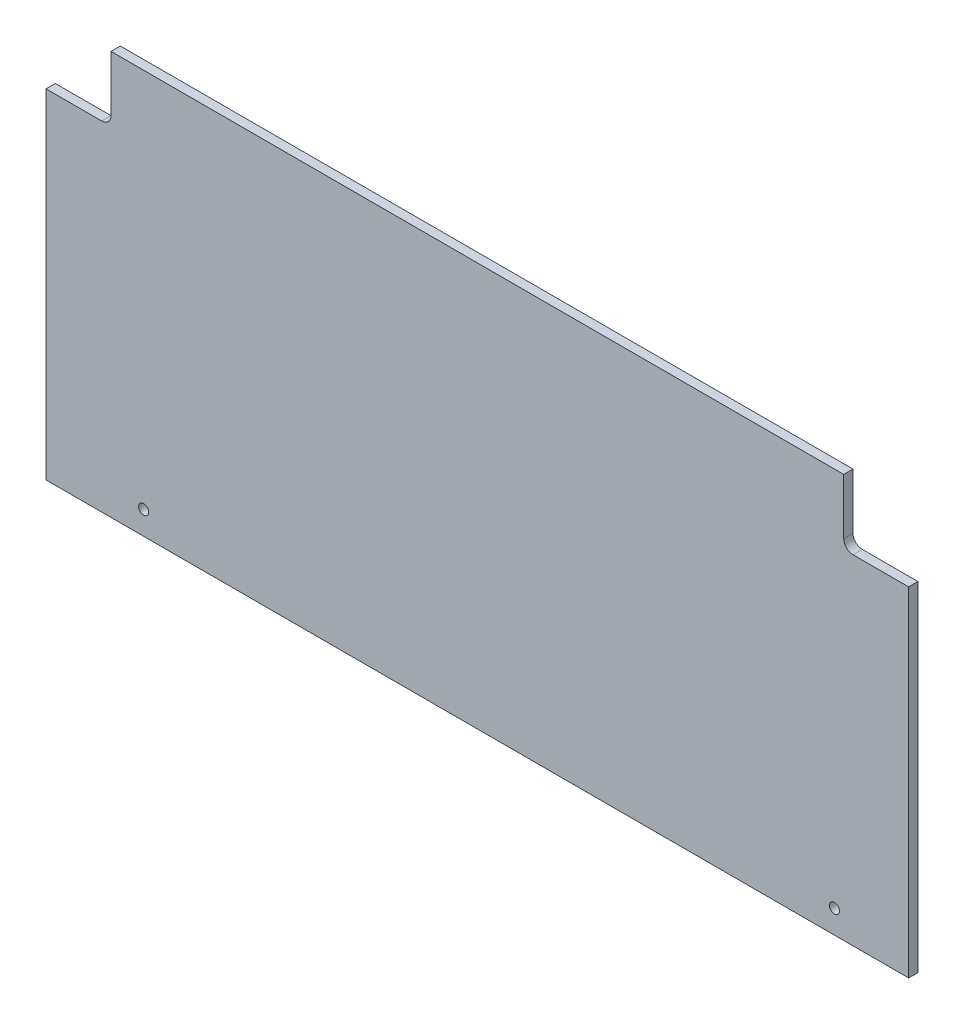
ISO-10303-21;
HEADER;
FILE_DESCRIPTION(('STEP AP214'),'2;1');
FILE_NAME('part.step','',(''),(''),'','','');
FILE_SCHEMA(('AUTOMOTIVE_DESIGN { 1 0 10303 214 1 1 1 1 }'));
ENDSEC;
DATA;
#1=APPLICATION_CONTEXT('core data for automotive mechanical design processes');
#2=APPLICATION_PROTOCOL_DEFINITION('international standard','automotive_design',2000,#1);
#3=PRODUCT_CONTEXT('',#1,'mechanical');
#4=PRODUCT('Part','Part','',(#3));
#5=PRODUCT_RELATED_PRODUCT_CATEGORY('part','',(#4));
#6=PRODUCT_DEFINITION_FORMATION('','',#4);
#7=PRODUCT_DEFINITION_CONTEXT('part definition',#1,'design');
#8=PRODUCT_DEFINITION('design','',#6,#7);
#9=PRODUCT_DEFINITION_SHAPE('','',#8);
#10=(LENGTH_UNIT() NAMED_UNIT(*) SI_UNIT(.MILLI.,.METRE.));
#11=(NAMED_UNIT(*) PLANE_ANGLE_UNIT() SI_UNIT($,.RADIAN.));
#12=(NAMED_UNIT(*) SI_UNIT($,.STERADIAN.) SOLID_ANGLE_UNIT());
#13=UNCERTAINTY_MEASURE_WITH_UNIT(LENGTH_MEASURE(1.E-05),#10,'distance_accuracy_value','');
#14=(GEOMETRIC_REPRESENTATION_CONTEXT(3) GLOBAL_UNCERTAINTY_ASSIGNED_CONTEXT((#13)) GLOBAL_UNIT_ASSIGNED_CONTEXT((#10,
#11,#12)) REPRESENTATION_CONTEXT('',''));
#15=CARTESIAN_POINT('',(0.,0.,0.));
#16=DIRECTION('',(0.,0.,1.));
#17=DIRECTION('',(1.,0.,0.));
#18=AXIS2_PLACEMENT_3D('',#15,#16,#17);
#19=CARTESIAN_POINT('',(-228.473,-122.174,-652.042983938942));
#20=DIRECTION('',(0.,0.,1.));
#21=DIRECTION('',(1.,0.,0.));
#22=AXIS2_PLACEMENT_3D('',#19,#20,#21);
#23=CYLINDRICAL_SURFACE('',#22,3.429);
#24=CARTESIAN_POINT('',(-228.473,-122.174,-6.35000000000005));
#25=DIRECTION('',(0.,0.,1.));
#26=DIRECTION('',(1.,0.,0.));
#27=AXIS2_PLACEMENT_3D('',#24,#25,#26);
#28=CIRCLE('',#27,3.429);
#29=CARTESIAN_POINT('',(-225.044,-122.174,-6.35000000000005));
#30=VERTEX_POINT('',#29);
#31=EDGE_CURVE('E160',#30,#30,#28,.T.);
#32=ORIENTED_EDGE('',*,*,#31,.F.);
#33=EDGE_LOOP('',(#32));
#34=FACE_BOUND('',#33,.T.);
#35=CARTESIAN_POINT('',(-228.473,-122.174,0.));
#36=DIRECTION('',(0.,0.,-1.));
#37=DIRECTION('',(0.,-1.,0.));
#38=AXIS2_PLACEMENT_3D('',#35,#36,#37);
#39=CIRCLE('',#38,3.429);
#40=CARTESIAN_POINT('',(-228.473,-125.603,0.));
#41=VERTEX_POINT('',#40);
#42=EDGE_CURVE('E171',#41,#41,#39,.T.);
#43=ORIENTED_EDGE('',*,*,#42,.F.);
#44=EDGE_LOOP('',(#43));
#45=FACE_BOUND('',#44,.T.);
#46=ADVANCED_FACE('F16',(#34,#45),#23,.F.);
#47=CARTESIAN_POINT('',(244.475,-122.174,-652.042983938942));
#48=DIRECTION('',(0.,0.,1.));
#49=DIRECTION('',(1.,0.,0.));
#50=AXIS2_PLACEMENT_3D('',#47,#48,#49);
#51=CYLINDRICAL_SURFACE('',#50,3.429);
#52=CARTESIAN_POINT('',(244.475,-122.174,-6.35000000000005));
#53=DIRECTION('',(0.,0.,1.));
#54=DIRECTION('',(1.,0.,0.));
#55=AXIS2_PLACEMENT_3D('',#52,#53,#54);
#56=CIRCLE('',#55,3.429);
#57=CARTESIAN_POINT('',(247.904,-122.174,-6.35000000000005));
#58=VERTEX_POINT('',#57);
#59=EDGE_CURVE('E136',#58,#58,#56,.T.);
#60=ORIENTED_EDGE('',*,*,#59,.F.);
#61=EDGE_LOOP('',(#60));
#62=FACE_BOUND('',#61,.T.);
#63=CARTESIAN_POINT('',(244.475,-122.174,0.));
#64=DIRECTION('',(0.,0.,-1.));
#65=DIRECTION('',(0.,-1.,0.));
#66=AXIS2_PLACEMENT_3D('',#63,#64,#65);
#67=CIRCLE('',#66,3.429);
#68=CARTESIAN_POINT('',(244.475,-125.603,0.));
#69=VERTEX_POINT('',#68);
#70=EDGE_CURVE('E178',#69,#69,#67,.T.);
#71=ORIENTED_EDGE('',*,*,#70,.F.);
#72=EDGE_LOOP('',(#71));
#73=FACE_BOUND('',#72,.T.);
#74=ADVANCED_FACE('F193',(#62,#73),#51,.F.);
#75=CARTESIAN_POINT('',(257.175,100.076,0.));
#76=DIRECTION('',(0.,0.,-1.));
#77=DIRECTION('',(0.,-1.,0.));
#78=AXIS2_PLACEMENT_3D('',#75,#76,#77);
#79=CYLINDRICAL_SURFACE('',#78,6.35);
#80=CARTESIAN_POINT('',(257.175,100.076,0.));
#81=DIRECTION('',(0.,0.,1.));
#82=DIRECTION('',(1.,0.,0.));
#83=AXIS2_PLACEMENT_3D('',#80,#81,#82);
#84=CIRCLE('',#83,6.35);
#85=CARTESIAN_POINT('',(250.825,100.076,0.));
#86=VERTEX_POINT('',#85);
#87=CARTESIAN_POINT('',(257.175,93.726,0.));
#88=VERTEX_POINT('',#87);
#89=EDGE_CURVE('E10',#86,#88,#84,.T.);
#90=ORIENTED_EDGE('',*,*,#89,.T.);
#91=DIRECTION('',(0.,0.,-1.));
#92=VECTOR('',#91,1.);
#93=CARTESIAN_POINT('',(257.175,93.726,0.));
#94=LINE('',#93,#92);
#95=CARTESIAN_POINT('',(257.175,93.726,-6.35));
#96=VERTEX_POINT('',#95);
#97=EDGE_CURVE('E26',#88,#96,#94,.T.);
#98=ORIENTED_EDGE('',*,*,#97,.T.);
#99=CARTESIAN_POINT('',(257.175,100.076,-6.35));
#100=DIRECTION('',(0.,0.,-1.));
#101=DIRECTION('',(0.,-1.,0.));
#102=AXIS2_PLACEMENT_3D('',#99,#100,#101);
#103=CIRCLE('',#102,6.35);
#104=CARTESIAN_POINT('',(250.825,100.076,-6.35));
#105=VERTEX_POINT('',#104);
#106=EDGE_CURVE('E174',#96,#105,#103,.T.);
#107=ORIENTED_EDGE('',*,*,#106,.T.);
#108=DIRECTION('',(0.,0.,1.));
#109=VECTOR('',#108,1.);
#110=CARTESIAN_POINT('',(250.825,100.076,-6.35));
#111=LINE('',#110,#109);
#112=EDGE_CURVE('E164',#105,#86,#111,.T.);
#113=ORIENTED_EDGE('',*,*,#112,.T.);
#114=EDGE_LOOP('',(#90,#98,#107,#113));
#115=FACE_BOUND('',#114,.T.);
#116=ADVANCED_FACE('F202',(#115),#79,.F.);
#117=CARTESIAN_POINT('',(250.825,93.726,0.));
#118=DIRECTION('',(0.,1.,0.));
#119=DIRECTION('',(0.,0.,1.));
#120=AXIS2_PLACEMENT_3D('',#117,#118,#119);
#121=PLANE('',#120);
#122=ORIENTED_EDGE('',*,*,#97,.F.);
#123=DIRECTION('',(-1.,0.,0.));
#124=VECTOR('',#123,1.);
#125=CARTESIAN_POINT('',(295.275,93.726,0.));
#126=LINE('',#125,#124);
#127=CARTESIAN_POINT('',(295.275,93.726,0.));
#128=VERTEX_POINT('',#127);
#129=EDGE_CURVE('E102',#128,#88,#126,.T.);
#130=ORIENTED_EDGE('',*,*,#129,.F.);
#131=DIRECTION('',(0.,0.,1.));
#132=VECTOR('',#131,1.);
#133=CARTESIAN_POINT('',(295.275,93.726,-6.35));
#134=LINE('',#133,#132);
#135=CARTESIAN_POINT('',(295.275,93.726,-6.35));
#136=VERTEX_POINT('',#135);
#137=EDGE_CURVE('E100',#136,#128,#134,.T.);
#138=ORIENTED_EDGE('',*,*,#137,.F.);
#139=DIRECTION('',(1.,0.,0.));
#140=VECTOR('',#139,1.);
#141=CARTESIAN_POINT('',(257.175,93.726,-6.35));
#142=LINE('',#141,#140);
#143=EDGE_CURVE('E151',#96,#136,#142,.T.);
#144=ORIENTED_EDGE('',*,*,#143,.F.);
#145=EDGE_LOOP('',(#122,#130,#138,#144));
#146=FACE_BOUND('',#145,.T.);
#147=ADVANCED_FACE('F209',(#146),#121,.T.);
#148=CARTESIAN_POINT('',(250.825,138.176,0.));
#149=DIRECTION('',(1.,0.,0.));
#150=DIRECTION('',(0.,0.,-1.));
#151=AXIS2_PLACEMENT_3D('',#148,#149,#150);
#152=PLANE('',#151);
#153=ORIENTED_EDGE('',*,*,#112,.F.);
#154=DIRECTION('',(0.,-1.,0.));
#155=VECTOR('',#154,1.);
#156=CARTESIAN_POINT('',(250.825,138.176,-6.35));
#157=LINE('',#156,#155);
#158=CARTESIAN_POINT('',(250.825,138.176,-6.35));
#159=VERTEX_POINT('',#158);
#160=EDGE_CURVE('E157',#159,#105,#157,.T.);
#161=ORIENTED_EDGE('',*,*,#160,.F.);
#162=DIRECTION('',(0.,0.,-1.));
#163=VECTOR('',#162,1.);
#164=CARTESIAN_POINT('',(250.825,138.176,0.));
#165=LINE('',#164,#163);
#166=CARTESIAN_POINT('',(250.825,138.176,0.));
#167=VERTEX_POINT('',#166);
#168=EDGE_CURVE('E156',#167,#159,#165,.T.);
#169=ORIENTED_EDGE('',*,*,#168,.F.);
#170=DIRECTION('',(0.,1.,0.));
#171=VECTOR('',#170,1.);
#172=CARTESIAN_POINT('',(250.825,100.076,0.));
#173=LINE('',#172,#171);
#174=EDGE_CURVE('E119',#86,#167,#173,.T.);
#175=ORIENTED_EDGE('',*,*,#174,.F.);
#176=EDGE_LOOP('',(#153,#161,#169,#175));
#177=FACE_BOUND('',#176,.T.);
#178=ADVANCED_FACE('F235',(#177),#152,.T.);
#179=CARTESIAN_POINT('',(-295.275,138.176,0.));
#180=DIRECTION('',(0.,1.,0.));
#181=DIRECTION('',(0.,0.,1.));
#182=AXIS2_PLACEMENT_3D('',#179,#180,#181);
#183=PLANE('',#182);
#184=ORIENTED_EDGE('',*,*,#168,.T.);
#185=DIRECTION('',(1.,0.,0.));
#186=VECTOR('',#185,1.);
#187=CARTESIAN_POINT('',(-250.825,138.176,-6.35));
#188=LINE('',#187,#186);
#189=CARTESIAN_POINT('',(-250.825,138.176,-6.35));
#190=VERTEX_POINT('',#189);
#191=EDGE_CURVE('E141',#190,#159,#188,.T.);
#192=ORIENTED_EDGE('',*,*,#191,.F.);
#193=DIRECTION('',(0.,0.,1.));
#194=VECTOR('',#193,1.);
#195=CARTESIAN_POINT('',(-250.825,138.176,-6.35));
#196=LINE('',#195,#194);
#197=CARTESIAN_POINT('',(-250.825,138.176,0.));
#198=VERTEX_POINT('',#197);
#199=EDGE_CURVE('E153',#190,#198,#196,.T.);
#200=ORIENTED_EDGE('',*,*,#199,.T.);
#201=DIRECTION('',(-1.,0.,0.));
#202=VECTOR('',#201,1.);
#203=CARTESIAN_POINT('',(250.825,138.176,0.));
#204=LINE('',#203,#202);
#205=EDGE_CURVE('E127',#167,#198,#204,.T.);
#206=ORIENTED_EDGE('',*,*,#205,.F.);
#207=EDGE_LOOP('',(#184,#192,#200,#206));
#208=FACE_BOUND('',#207,.T.);
#209=ADVANCED_FACE('F231',(#208),#183,.T.);
#210=CARTESIAN_POINT('',(0.,0.,-6.35));
#211=DIRECTION('',(0.,0.,1.));
#212=DIRECTION('',(1.,0.,0.));
#213=AXIS2_PLACEMENT_3D('',#210,#211,#212);
#214=PLANE('',#213);
#215=ORIENTED_EDGE('',*,*,#160,.T.);
#216=ORIENTED_EDGE('',*,*,#106,.F.);
#217=ORIENTED_EDGE('',*,*,#143,.T.);
#218=DIRECTION('',(0.,-1.,0.));
#219=VECTOR('',#218,1.);
#220=CARTESIAN_POINT('',(295.275,93.726,-6.35));
#221=LINE('',#220,#219);
#222=CARTESIAN_POINT('',(295.275,-138.176,-6.35));
#223=VERTEX_POINT('',#222);
#224=EDGE_CURVE('E149',#136,#223,#221,.T.);
#225=ORIENTED_EDGE('',*,*,#224,.T.);
#226=DIRECTION('',(-1.,0.,0.));
#227=VECTOR('',#226,1.);
#228=CARTESIAN_POINT('',(295.275,-138.176,-6.35));
#229=LINE('',#228,#227);
#230=CARTESIAN_POINT('',(-295.275,-138.176,-6.35));
#231=VERTEX_POINT('',#230);
#232=EDGE_CURVE('E109',#223,#231,#229,.T.);
#233=ORIENTED_EDGE('',*,*,#232,.T.);
#234=DIRECTION('',(0.,1.,0.));
#235=VECTOR('',#234,1.);
#236=CARTESIAN_POINT('',(-295.275,-138.176,-6.35));
#237=LINE('',#236,#235);
#238=CARTESIAN_POINT('',(-295.275,93.726,-6.35));
#239=VERTEX_POINT('',#238);
#240=EDGE_CURVE('E145',#231,#239,#237,.T.);
#241=ORIENTED_EDGE('',*,*,#240,.T.);
#242=DIRECTION('',(1.,0.,0.));
#243=VECTOR('',#242,1.);
#244=CARTESIAN_POINT('',(-295.275,93.726,-6.35));
#245=LINE('',#244,#243);
#246=CARTESIAN_POINT('',(-257.175,93.726,-6.35));
#247=VERTEX_POINT('',#246);
#248=EDGE_CURVE('E140',#239,#247,#245,.T.);
#249=ORIENTED_EDGE('',*,*,#248,.T.);
#250=CARTESIAN_POINT('',(-257.175,100.076,-6.35));
#251=DIRECTION('',(0.,0.,-1.));
#252=DIRECTION('',(0.,-1.,0.));
#253=AXIS2_PLACEMENT_3D('',#250,#251,#252);
#254=CIRCLE('',#253,6.35);
#255=CARTESIAN_POINT('',(-250.825,100.076,-6.35));
#256=VERTEX_POINT('',#255);
#257=EDGE_CURVE('E129',#256,#247,#254,.T.);
#258=ORIENTED_EDGE('',*,*,#257,.F.);
#259=DIRECTION('',(0.,1.,0.));
#260=VECTOR('',#259,1.);
#261=CARTESIAN_POINT('',(-250.825,100.076,-6.35));
#262=LINE('',#261,#260);
#263=EDGE_CURVE('E137',#256,#190,#262,.T.);
#264=ORIENTED_EDGE('',*,*,#263,.T.);
#265=ORIENTED_EDGE('',*,*,#191,.T.);
#266=EDGE_LOOP('',(#215,#216,#217,#225,#233,#241,#249,#258,#264,#265));
#267=FACE_BOUND('',#266,.T.);
#268=ORIENTED_EDGE('',*,*,#31,.T.);
#269=EDGE_LOOP('',(#268));
#270=FACE_BOUND('',#269,.T.);
#271=ORIENTED_EDGE('',*,*,#59,.T.);
#272=EDGE_LOOP('',(#271));
#273=FACE_BOUND('',#272,.T.);
#274=ADVANCED_FACE('F188',(#267,#270,#273),#214,.F.);
#275=CARTESIAN_POINT('',(-257.175,100.076,0.));
#276=DIRECTION('',(0.,0.,-1.));
#277=DIRECTION('',(0.,-1.,0.));
#278=AXIS2_PLACEMENT_3D('',#275,#276,#277);
#279=CYLINDRICAL_SURFACE('',#278,6.35);
#280=CARTESIAN_POINT('',(-257.175,100.076,0.));
#281=DIRECTION('',(0.,0.,1.));
#282=DIRECTION('',(1.,0.,0.));
#283=AXIS2_PLACEMENT_3D('',#280,#281,#282);
#284=CIRCLE('',#283,6.35);
#285=CARTESIAN_POINT('',(-257.175,93.726,0.));
#286=VERTEX_POINT('',#285);
#287=CARTESIAN_POINT('',(-250.825,100.076,0.));
#288=VERTEX_POINT('',#287);
#289=EDGE_CURVE('E133',#286,#288,#284,.T.);
#290=ORIENTED_EDGE('',*,*,#289,.T.);
#291=DIRECTION('',(0.,0.,-1.));
#292=VECTOR('',#291,1.);
#293=CARTESIAN_POINT('',(-250.825,100.076,0.));
#294=LINE('',#293,#292);
#295=EDGE_CURVE('E130',#288,#256,#294,.T.);
#296=ORIENTED_EDGE('',*,*,#295,.T.);
#297=ORIENTED_EDGE('',*,*,#257,.T.);
#298=DIRECTION('',(0.,0.,1.));
#299=VECTOR('',#298,1.);
#300=CARTESIAN_POINT('',(-257.175,93.726,-6.35));
#301=LINE('',#300,#299);
#302=EDGE_CURVE('E124',#247,#286,#301,.T.);
#303=ORIENTED_EDGE('',*,*,#302,.T.);
#304=EDGE_LOOP('',(#290,#296,#297,#303));
#305=FACE_BOUND('',#304,.T.);
#306=ADVANCED_FACE('F18',(#305),#279,.F.);
#307=CARTESIAN_POINT('',(-250.825,138.176,0.));
#308=DIRECTION('',(1.,0.,0.));
#309=DIRECTION('',(0.,0.,-1.));
#310=AXIS2_PLACEMENT_3D('',#307,#308,#309);
#311=PLANE('',#310);
#312=ORIENTED_EDGE('',*,*,#295,.F.);
#313=DIRECTION('',(0.,-1.,0.));
#314=VECTOR('',#313,1.);
#315=CARTESIAN_POINT('',(-250.825,138.176,0.));
#316=LINE('',#315,#314);
#317=EDGE_CURVE('E116',#198,#288,#316,.T.);
#318=ORIENTED_EDGE('',*,*,#317,.F.);
#319=ORIENTED_EDGE('',*,*,#199,.F.);
#320=ORIENTED_EDGE('',*,*,#263,.F.);
#321=EDGE_LOOP('',(#312,#318,#319,#320));
#322=FACE_BOUND('',#321,.T.);
#323=ADVANCED_FACE('F224',(#322),#311,.F.);
#324=CARTESIAN_POINT('',(-250.825,93.726,0.));
#325=DIRECTION('',(0.,-1.,0.));
#326=DIRECTION('',(0.,0.,-1.));
#327=AXIS2_PLACEMENT_3D('',#324,#325,#326);
#328=PLANE('',#327);
#329=ORIENTED_EDGE('',*,*,#302,.F.);
#330=ORIENTED_EDGE('',*,*,#248,.F.);
#331=DIRECTION('',(0.,0.,-1.));
#332=VECTOR('',#331,1.);
#333=CARTESIAN_POINT('',(-295.275,93.726,0.));
#334=LINE('',#333,#332);
#335=CARTESIAN_POINT('',(-295.275,93.726,0.));
#336=VERTEX_POINT('',#335);
#337=EDGE_CURVE('E121',#336,#239,#334,.T.);
#338=ORIENTED_EDGE('',*,*,#337,.F.);
#339=DIRECTION('',(-1.,0.,0.));
#340=VECTOR('',#339,1.);
#341=CARTESIAN_POINT('',(-257.175,93.726,0.));
#342=LINE('',#341,#340);
#343=EDGE_CURVE('E114',#286,#336,#342,.T.);
#344=ORIENTED_EDGE('',*,*,#343,.F.);
#345=EDGE_LOOP('',(#329,#330,#338,#344));
#346=FACE_BOUND('',#345,.T.);
#347=ADVANCED_FACE('F220',(#346),#328,.F.);
#348=CARTESIAN_POINT('',(-295.275,-138.176,0.));
#349=DIRECTION('',(-1.,0.,0.));
#350=DIRECTION('',(0.,0.,1.));
#351=AXIS2_PLACEMENT_3D('',#348,#349,#350);
#352=PLANE('',#351);
#353=ORIENTED_EDGE('',*,*,#337,.T.);
#354=ORIENTED_EDGE('',*,*,#240,.F.);
#355=DIRECTION('',(0.,0.,-1.));
#356=VECTOR('',#355,1.);
#357=CARTESIAN_POINT('',(-295.275,-138.176,0.));
#358=LINE('',#357,#356);
#359=CARTESIAN_POINT('',(-295.275,-138.176,0.));
#360=VERTEX_POINT('',#359);
#361=EDGE_CURVE('E111',#360,#231,#358,.T.);
#362=ORIENTED_EDGE('',*,*,#361,.F.);
#363=DIRECTION('',(0.,-1.,0.));
#364=VECTOR('',#363,1.);
#365=CARTESIAN_POINT('',(-295.275,93.726,0.));
#366=LINE('',#365,#364);
#367=EDGE_CURVE('E88',#336,#360,#366,.T.);
#368=ORIENTED_EDGE('',*,*,#367,.F.);
#369=EDGE_LOOP('',(#353,#354,#362,#368));
#370=FACE_BOUND('',#369,.T.);
#371=ADVANCED_FACE('F217',(#370),#352,.T.);
#372=CARTESIAN_POINT('',(295.275,138.176,0.));
#373=DIRECTION('',(1.,0.,0.));
#374=DIRECTION('',(0.,0.,-1.));
#375=AXIS2_PLACEMENT_3D('',#372,#373,#374);
#376=PLANE('',#375);
#377=ORIENTED_EDGE('',*,*,#137,.T.);
#378=DIRECTION('',(0.,1.,0.));
#379=VECTOR('',#378,1.);
#380=CARTESIAN_POINT('',(295.275,-138.176,0.));
#381=LINE('',#380,#379);
#382=CARTESIAN_POINT('',(295.275,-138.176,0.));
#383=VERTEX_POINT('',#382);
#384=EDGE_CURVE('E95',#383,#128,#381,.T.);
#385=ORIENTED_EDGE('',*,*,#384,.F.);
#386=DIRECTION('',(0.,0.,-1.));
#387=VECTOR('',#386,1.);
#388=CARTESIAN_POINT('',(295.275,-138.176,0.));
#389=LINE('',#388,#387);
#390=EDGE_CURVE('E99',#383,#223,#389,.T.);
#391=ORIENTED_EDGE('',*,*,#390,.T.);
#392=ORIENTED_EDGE('',*,*,#224,.F.);
#393=EDGE_LOOP('',(#377,#385,#391,#392));
#394=FACE_BOUND('',#393,.T.);
#395=ADVANCED_FACE('F97',(#394),#376,.T.);
#396=CARTESIAN_POINT('',(295.275,-138.176,0.));
#397=DIRECTION('',(0.,-1.,0.));
#398=DIRECTION('',(0.,0.,-1.));
#399=AXIS2_PLACEMENT_3D('',#396,#397,#398);
#400=PLANE('',#399);
#401=DIRECTION('',(1.,0.,0.));
#402=VECTOR('',#401,1.);
#403=CARTESIAN_POINT('',(-295.275,-138.176,0.));
#404=LINE('',#403,#402);
#405=EDGE_CURVE('E20',#360,#383,#404,.T.);
#406=ORIENTED_EDGE('',*,*,#405,.F.);
#407=ORIENTED_EDGE('',*,*,#361,.T.);
#408=ORIENTED_EDGE('',*,*,#232,.F.);
#409=ORIENTED_EDGE('',*,*,#390,.F.);
#410=EDGE_LOOP('',(#406,#407,#408,#409));
#411=FACE_BOUND('',#410,.T.);
#412=ADVANCED_FACE('F106',(#411),#400,.T.);
#413=CARTESIAN_POINT('',(0.,0.,0.));
#414=DIRECTION('',(0.,0.,1.));
#415=DIRECTION('',(1.,0.,0.));
#416=AXIS2_PLACEMENT_3D('',#413,#414,#415);
#417=PLANE('',#416);
#418=ORIENTED_EDGE('',*,*,#174,.T.);
#419=ORIENTED_EDGE('',*,*,#205,.T.);
#420=ORIENTED_EDGE('',*,*,#317,.T.);
#421=ORIENTED_EDGE('',*,*,#289,.F.);
#422=ORIENTED_EDGE('',*,*,#343,.T.);
#423=ORIENTED_EDGE('',*,*,#367,.T.);
#424=ORIENTED_EDGE('',*,*,#405,.T.);
#425=ORIENTED_EDGE('',*,*,#384,.T.);
#426=ORIENTED_EDGE('',*,*,#129,.T.);
#427=ORIENTED_EDGE('',*,*,#89,.F.);
#428=EDGE_LOOP('',(#418,#419,#420,#421,#422,#423,#424,#425,#426,#427));
#429=FACE_BOUND('',#428,.T.);
#430=ORIENTED_EDGE('',*,*,#42,.T.);
#431=EDGE_LOOP('',(#430));
#432=FACE_BOUND('',#431,.T.);
#433=ORIENTED_EDGE('',*,*,#70,.T.);
#434=EDGE_LOOP('',(#433));
#435=FACE_BOUND('',#434,.T.);
#436=ADVANCED_FACE('F112',(#429,#432,#435),#417,.T.);
#437=CLOSED_SHELL('',(#46,#74,#116,#147,#178,#209,#274,#306,#323,#347,#371,#395,#412,#436));
#438=MANIFOLD_SOLID_BREP('B1',#437);
#439=ADVANCED_BREP_SHAPE_REPRESENTATION('',(#18,#438),#14);
#440=SHAPE_DEFINITION_REPRESENTATION(#9,#439);
ENDSEC;
END-ISO-10303-21;
